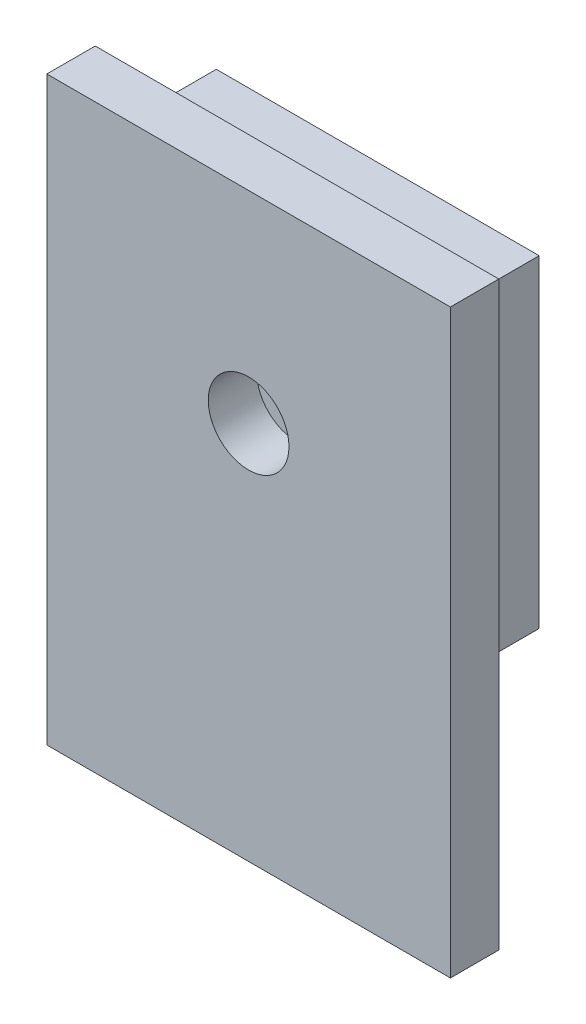
ISO-10303-21;
HEADER;
FILE_DESCRIPTION(('STEP AP214'),'2;1');
FILE_NAME('part.step','',(''),(''),'','','');
FILE_SCHEMA(('AUTOMOTIVE_DESIGN { 1 0 10303 214 1 1 1 1 }'));
ENDSEC;
DATA;
#1=APPLICATION_CONTEXT('core data for automotive mechanical design processes');
#2=APPLICATION_PROTOCOL_DEFINITION('international standard','automotive_design',2000,#1);
#3=PRODUCT_CONTEXT('',#1,'mechanical');
#4=PRODUCT('Part','Part','',(#3));
#5=PRODUCT_RELATED_PRODUCT_CATEGORY('part','',(#4));
#6=PRODUCT_DEFINITION_FORMATION('','',#4);
#7=PRODUCT_DEFINITION_CONTEXT('part definition',#1,'design');
#8=PRODUCT_DEFINITION('design','',#6,#7);
#9=PRODUCT_DEFINITION_SHAPE('','',#8);
#10=(LENGTH_UNIT() NAMED_UNIT(*) SI_UNIT(.MILLI.,.METRE.));
#11=(NAMED_UNIT(*) PLANE_ANGLE_UNIT() SI_UNIT($,.RADIAN.));
#12=(NAMED_UNIT(*) SI_UNIT($,.STERADIAN.) SOLID_ANGLE_UNIT());
#13=UNCERTAINTY_MEASURE_WITH_UNIT(LENGTH_MEASURE(1.E-05),#10,'distance_accuracy_value','');
#14=(GEOMETRIC_REPRESENTATION_CONTEXT(3) GLOBAL_UNCERTAINTY_ASSIGNED_CONTEXT((#13)) GLOBAL_UNIT_ASSIGNED_CONTEXT((#10,
#11,#12)) REPRESENTATION_CONTEXT('',''));
#15=CARTESIAN_POINT('',(0.,0.,0.));
#16=DIRECTION('',(0.,0.,1.));
#17=DIRECTION('',(1.,0.,0.));
#18=AXIS2_PLACEMENT_3D('',#15,#16,#17);
#19=CARTESIAN_POINT('',(-1.00208293355679,0.997840992775482,-1.6));
#20=DIRECTION('',(0.,0.,-1.));
#21=DIRECTION('',(-1.,0.,0.));
#22=AXIS2_PLACEMENT_3D('',#19,#20,#21);
#23=CYLINDRICAL_SURFACE('',#22,0.25);
#24=CARTESIAN_POINT('',(-1.00208293355679,0.997840992775482,-1.6));
#25=DIRECTION('',(0.,0.,-1.));
#26=DIRECTION('',(-1.,0.,0.));
#27=AXIS2_PLACEMENT_3D('',#24,#25,#26);
#28=CIRCLE('',#27,0.25);
#29=CARTESIAN_POINT('',(-1.25208293355679,0.997840992775482,-1.6));
#30=VERTEX_POINT('',#29);
#31=EDGE_CURVE('P0_E126',#30,#30,#28,.T.);
#32=ORIENTED_EDGE('',*,*,#31,.T.);
#33=EDGE_LOOP('',(#32));
#34=FACE_BOUND('',#33,.T.);
#35=CARTESIAN_POINT('',(-1.00208293355679,0.997840992775482,-1.59));
#36=DIRECTION('',(0.,0.,-1.));
#37=DIRECTION('',(-1.,0.,0.));
#38=AXIS2_PLACEMENT_3D('',#35,#36,#37);
#39=CIRCLE('',#38,0.25);
#40=CARTESIAN_POINT('',(-1.25208293355679,0.997840992775482,-1.59));
#41=VERTEX_POINT('',#40);
#42=EDGE_CURVE('P0_E11',#41,#41,#39,.T.);
#43=ORIENTED_EDGE('',*,*,#42,.F.);
#44=EDGE_LOOP('',(#43));
#45=FACE_BOUND('',#44,.T.);
#46=ADVANCED_FACE('P0_F19',(#34,#45),#23,.F.);
#47=CARTESIAN_POINT('',(-1.00208293355679,0.997840992775482,-1.59));
#48=DIRECTION('',(0.,0.,1.));
#49=DIRECTION('',(1.,0.,0.));
#50=AXIS2_PLACEMENT_3D('',#47,#48,#49);
#51=PLANE('',#50);
#52=ORIENTED_EDGE('',*,*,#42,.T.);
#53=EDGE_LOOP('',(#52));
#54=FACE_BOUND('',#53,.T.);
#55=ADVANCED_FACE('P0_F230',(#54),#51,.F.);
#56=CARTESIAN_POINT('',(-2.,-2.,-0.6));
#57=DIRECTION('',(0.,1.,0.));
#58=DIRECTION('',(1.,0.,0.));
#59=AXIS2_PLACEMENT_3D('',#56,#57,#58);
#60=PLANE('',#59);
#61=DIRECTION('',(1.,0.,0.));
#62=VECTOR('',#61,1.);
#63=CARTESIAN_POINT('',(-2.,-2.,-0.6));
#64=LINE('',#63,#62);
#65=CARTESIAN_POINT('',(-2.,-2.,-0.6));
#66=VERTEX_POINT('',#65);
#67=CARTESIAN_POINT('',(2.,-2.,-0.6));
#68=VERTEX_POINT('',#67);
#69=EDGE_CURVE('P0_E97',#66,#68,#64,.T.);
#70=ORIENTED_EDGE('',*,*,#69,.F.);
#71=DIRECTION('',(0.,0.,-1.));
#72=VECTOR('',#71,1.);
#73=CARTESIAN_POINT('',(-2.,-2.,-0.6));
#74=LINE('',#73,#72);
#75=CARTESIAN_POINT('',(-2.,-2.,-1.6));
#76=VERTEX_POINT('',#75);
#77=EDGE_CURVE('P0_E30',#66,#76,#74,.T.);
#78=ORIENTED_EDGE('',*,*,#77,.T.);
#79=DIRECTION('',(1.,0.,0.));
#80=VECTOR('',#79,1.);
#81=CARTESIAN_POINT('',(-2.,-2.,-1.6));
#82=LINE('',#81,#80);
#83=CARTESIAN_POINT('',(2.,-2.,-1.6));
#84=VERTEX_POINT('',#83);
#85=EDGE_CURVE('P0_E109',#76,#84,#82,.T.);
#86=ORIENTED_EDGE('',*,*,#85,.T.);
#87=DIRECTION('',(0.,0.,-1.));
#88=VECTOR('',#87,1.);
#89=CARTESIAN_POINT('',(2.,-2.,-0.6));
#90=LINE('',#89,#88);
#91=EDGE_CURVE('P0_E85',#68,#84,#90,.T.);
#92=ORIENTED_EDGE('',*,*,#91,.F.);
#93=EDGE_LOOP('',(#70,#78,#86,#92));
#94=FACE_BOUND('',#93,.T.);
#95=ADVANCED_FACE('P0_F220',(#94),#60,.F.);
#96=CARTESIAN_POINT('',(-2.,2.,-0.6));
#97=DIRECTION('',(1.,0.,0.));
#98=DIRECTION('',(0.,1.,0.));
#99=AXIS2_PLACEMENT_3D('',#96,#97,#98);
#100=PLANE('',#99);
#101=DIRECTION('',(0.,-1.,0.));
#102=VECTOR('',#101,1.);
#103=CARTESIAN_POINT('',(-2.,2.,-0.6));
#104=LINE('',#103,#102);
#105=CARTESIAN_POINT('',(-2.,2.,-0.6));
#106=VERTEX_POINT('',#105);
#107=EDGE_CURVE('P0_E92',#106,#66,#104,.T.);
#108=ORIENTED_EDGE('',*,*,#107,.F.);
#109=DIRECTION('',(0.,0.,-1.));
#110=VECTOR('',#109,1.);
#111=CARTESIAN_POINT('',(-2.,2.,-0.6));
#112=LINE('',#111,#110);
#113=CARTESIAN_POINT('',(-2.,2.,-1.6));
#114=VERTEX_POINT('',#113);
#115=EDGE_CURVE('P0_E70',#106,#114,#112,.T.);
#116=ORIENTED_EDGE('',*,*,#115,.T.);
#117=DIRECTION('',(0.,-1.,0.));
#118=VECTOR('',#117,1.);
#119=CARTESIAN_POINT('',(-2.,2.,-1.6));
#120=LINE('',#119,#118);
#121=EDGE_CURVE('P0_E106',#114,#76,#120,.T.);
#122=ORIENTED_EDGE('',*,*,#121,.T.);
#123=ORIENTED_EDGE('',*,*,#77,.F.);
#124=EDGE_LOOP('',(#108,#116,#122,#123));
#125=FACE_BOUND('',#124,.T.);
#126=ADVANCED_FACE('P0_F209',(#125),#100,.F.);
#127=CARTESIAN_POINT('',(2.,2.,-0.6));
#128=DIRECTION('',(0.,-1.,0.));
#129=DIRECTION('',(0.,0.,-1.));
#130=AXIS2_PLACEMENT_3D('',#127,#128,#129);
#131=PLANE('',#130);
#132=DIRECTION('',(-1.,0.,0.));
#133=VECTOR('',#132,1.);
#134=CARTESIAN_POINT('',(2.,2.,-0.6));
#135=LINE('',#134,#133);
#136=CARTESIAN_POINT('',(2.,2.,-0.6));
#137=VERTEX_POINT('',#136);
#138=EDGE_CURVE('P0_E88',#137,#106,#135,.T.);
#139=ORIENTED_EDGE('',*,*,#138,.F.);
#140=DIRECTION('',(0.,0.,-1.));
#141=VECTOR('',#140,1.);
#142=CARTESIAN_POINT('',(2.,2.,-0.6));
#143=LINE('',#142,#141);
#144=CARTESIAN_POINT('',(2.,2.,-1.6));
#145=VERTEX_POINT('',#144);
#146=EDGE_CURVE('P0_E77',#137,#145,#143,.T.);
#147=ORIENTED_EDGE('',*,*,#146,.T.);
#148=DIRECTION('',(-1.,0.,0.));
#149=VECTOR('',#148,1.);
#150=CARTESIAN_POINT('',(2.,2.,-1.6));
#151=LINE('',#150,#149);
#152=EDGE_CURVE('P0_E23',#145,#114,#151,.T.);
#153=ORIENTED_EDGE('',*,*,#152,.T.);
#154=ORIENTED_EDGE('',*,*,#115,.F.);
#155=EDGE_LOOP('',(#139,#147,#153,#154));
#156=FACE_BOUND('',#155,.T.);
#157=ADVANCED_FACE('P0_F21',(#156),#131,.F.);
#158=CARTESIAN_POINT('',(2.,-2.,-0.6));
#159=DIRECTION('',(-1.,0.,0.));
#160=DIRECTION('',(0.,0.,1.));
#161=AXIS2_PLACEMENT_3D('',#158,#159,#160);
#162=PLANE('',#161);
#163=DIRECTION('',(0.,1.,0.));
#164=VECTOR('',#163,1.);
#165=CARTESIAN_POINT('',(2.,-2.,-0.6));
#166=LINE('',#165,#164);
#167=EDGE_CURVE('P0_E80',#68,#137,#166,.T.);
#168=ORIENTED_EDGE('',*,*,#167,.F.);
#169=ORIENTED_EDGE('',*,*,#91,.T.);
#170=DIRECTION('',(0.,1.,0.));
#171=VECTOR('',#170,1.);
#172=CARTESIAN_POINT('',(2.,-2.,-1.6));
#173=LINE('',#172,#171);
#174=EDGE_CURVE('P0_E82',#84,#145,#173,.T.);
#175=ORIENTED_EDGE('',*,*,#174,.T.);
#176=ORIENTED_EDGE('',*,*,#146,.F.);
#177=EDGE_LOOP('',(#168,#169,#175,#176));
#178=FACE_BOUND('',#177,.T.);
#179=ADVANCED_FACE('P0_F78',(#178),#162,.F.);
#180=CARTESIAN_POINT('',(0.,0.,-1.6));
#181=DIRECTION('',(0.,0.,1.));
#182=DIRECTION('',(1.,0.,0.));
#183=AXIS2_PLACEMENT_3D('',#180,#181,#182);
#184=PLANE('',#183);
#185=ORIENTED_EDGE('',*,*,#174,.F.);
#186=ORIENTED_EDGE('',*,*,#85,.F.);
#187=ORIENTED_EDGE('',*,*,#121,.F.);
#188=ORIENTED_EDGE('',*,*,#152,.F.);
#189=EDGE_LOOP('',(#185,#186,#187,#188));
#190=FACE_BOUND('',#189,.T.);
#191=ORIENTED_EDGE('',*,*,#31,.F.);
#192=EDGE_LOOP('',(#191));
#193=FACE_BOUND('',#192,.T.);
#194=ADVANCED_FACE('P0_F178',(#190,#193),#184,.F.);
#195=CARTESIAN_POINT('',(0.,0.,-0.6));
#196=DIRECTION('',(0.,0.,1.));
#197=DIRECTION('',(1.,0.,0.));
#198=AXIS2_PLACEMENT_3D('',#195,#196,#197);
#199=PLANE('',#198);
#200=ORIENTED_EDGE('',*,*,#167,.T.);
#201=ORIENTED_EDGE('',*,*,#138,.T.);
#202=ORIENTED_EDGE('',*,*,#107,.T.);
#203=ORIENTED_EDGE('',*,*,#69,.T.);
#204=EDGE_LOOP('',(#200,#201,#202,#203));
#205=FACE_BOUND('',#204,.T.);
#206=ADVANCED_FACE('P0_F95',(#205),#199,.T.);
#207=CLOSED_SHELL('',(#46,#55,#95,#126,#157,#179,#194,#206));
#208=MANIFOLD_SOLID_BREP('P0_B1',#207);
#209=CARTESIAN_POINT('',(0.,0.,0.));
#210=DIRECTION('',(0.,0.,1.));
#211=DIRECTION('',(1.,0.,0.));
#212=AXIS2_PLACEMENT_3D('',#209,#210,#211);
#213=CYLINDRICAL_SURFACE('',#212,0.5);
#214=CARTESIAN_POINT('',(0.,0.,-0.6));
#215=DIRECTION('',(0.,0.,-1.));
#216=DIRECTION('',(1.,0.,0.));
#217=AXIS2_PLACEMENT_3D('',#214,#215,#216);
#218=CIRCLE('',#217,0.5);
#219=CARTESIAN_POINT('',(0.5,0.,-0.6));
#220=VERTEX_POINT('',#219);
#221=EDGE_CURVE('P1_E84',#220,#220,#218,.T.);
#222=ORIENTED_EDGE('',*,*,#221,.T.);
#223=EDGE_LOOP('',(#222));
#224=FACE_BOUND('',#223,.T.);
#225=CARTESIAN_POINT('',(0.,0.,0.));
#226=DIRECTION('',(0.,0.,-1.));
#227=DIRECTION('',(1.,0.,0.));
#228=AXIS2_PLACEMENT_3D('',#225,#226,#227);
#229=CIRCLE('',#228,0.5);
#230=CARTESIAN_POINT('',(0.5,0.,0.));
#231=VERTEX_POINT('',#230);
#232=EDGE_CURVE('P1_E23',#231,#231,#229,.T.);
#233=ORIENTED_EDGE('',*,*,#232,.F.);
#234=EDGE_LOOP('',(#233));
#235=FACE_BOUND('',#234,.T.);
#236=ADVANCED_FACE('P1_F19',(#224,#235),#213,.F.);
#237=CARTESIAN_POINT('',(-2.5,-4.7,0.));
#238=DIRECTION('',(0.,1.,0.));
#239=DIRECTION('',(1.,0.,0.));
#240=AXIS2_PLACEMENT_3D('',#237,#238,#239);
#241=PLANE('',#240);
#242=DIRECTION('',(-1.,0.,0.));
#243=VECTOR('',#242,1.);
#244=CARTESIAN_POINT('',(2.5,-4.7,0.));
#245=LINE('',#244,#243);
#246=CARTESIAN_POINT('',(2.5,-4.7,0.));
#247=VERTEX_POINT('',#246);
#248=CARTESIAN_POINT('',(-2.5,-4.7,0.));
#249=VERTEX_POINT('',#248);
#250=EDGE_CURVE('P1_E89',#247,#249,#245,.T.);
#251=ORIENTED_EDGE('',*,*,#250,.T.);
#252=DIRECTION('',(0.,0.,-1.));
#253=VECTOR('',#252,1.);
#254=CARTESIAN_POINT('',(-2.5,-4.7,0.));
#255=LINE('',#254,#253);
#256=CARTESIAN_POINT('',(-2.5,-4.7,-0.6));
#257=VERTEX_POINT('',#256);
#258=EDGE_CURVE('P1_E11',#249,#257,#255,.T.);
#259=ORIENTED_EDGE('',*,*,#258,.T.);
#260=DIRECTION('',(1.,0.,0.));
#261=VECTOR('',#260,1.);
#262=CARTESIAN_POINT('',(2.5,-4.7,-0.6));
#263=LINE('',#262,#261);
#264=CARTESIAN_POINT('',(2.5,-4.7,-0.6));
#265=VERTEX_POINT('',#264);
#266=EDGE_CURVE('P1_E96',#257,#265,#263,.T.);
#267=ORIENTED_EDGE('',*,*,#266,.T.);
#268=DIRECTION('',(0.,0.,-1.));
#269=VECTOR('',#268,1.);
#270=CARTESIAN_POINT('',(2.5,-4.7,0.));
#271=LINE('',#270,#269);
#272=EDGE_CURVE('P1_E77',#247,#265,#271,.T.);
#273=ORIENTED_EDGE('',*,*,#272,.F.);
#274=EDGE_LOOP('',(#251,#259,#267,#273));
#275=FACE_BOUND('',#274,.T.);
#276=ADVANCED_FACE('P1_F215',(#275),#241,.F.);
#277=CARTESIAN_POINT('',(-2.5,2.5,0.));
#278=DIRECTION('',(1.,0.,0.));
#279=DIRECTION('',(0.,1.,0.));
#280=AXIS2_PLACEMENT_3D('',#277,#278,#279);
#281=PLANE('',#280);
#282=DIRECTION('',(0.,1.,0.));
#283=VECTOR('',#282,1.);
#284=CARTESIAN_POINT('',(-2.5,0.,0.));
#285=LINE('',#284,#283);
#286=CARTESIAN_POINT('',(-2.5,2.5,0.));
#287=VERTEX_POINT('',#286);
#288=EDGE_CURVE('P1_E99',#249,#287,#285,.T.);
#289=ORIENTED_EDGE('',*,*,#288,.T.);
#290=DIRECTION('',(0.,0.,-1.));
#291=VECTOR('',#290,1.);
#292=CARTESIAN_POINT('',(-2.5,2.5,0.));
#293=LINE('',#292,#291);
#294=CARTESIAN_POINT('',(-2.5,2.5,-0.6));
#295=VERTEX_POINT('',#294);
#296=EDGE_CURVE('P1_E30',#287,#295,#293,.T.);
#297=ORIENTED_EDGE('',*,*,#296,.T.);
#298=DIRECTION('',(0.,-1.,0.));
#299=VECTOR('',#298,1.);
#300=CARTESIAN_POINT('',(-2.5,0.,-0.6));
#301=LINE('',#300,#299);
#302=EDGE_CURVE('P1_E107',#295,#257,#301,.T.);
#303=ORIENTED_EDGE('',*,*,#302,.T.);
#304=ORIENTED_EDGE('',*,*,#258,.F.);
#305=EDGE_LOOP('',(#289,#297,#303,#304));
#306=FACE_BOUND('',#305,.T.);
#307=ADVANCED_FACE('P1_F206',(#306),#281,.F.);
#308=CARTESIAN_POINT('',(2.5,2.5,0.));
#309=DIRECTION('',(0.,-1.,0.));
#310=DIRECTION('',(0.,0.,-1.));
#311=AXIS2_PLACEMENT_3D('',#308,#309,#310);
#312=PLANE('',#311);
#313=DIRECTION('',(1.,0.,0.));
#314=VECTOR('',#313,1.);
#315=CARTESIAN_POINT('',(-2.5,2.5,0.));
#316=LINE('',#315,#314);
#317=CARTESIAN_POINT('',(2.5,2.5,0.));
#318=VERTEX_POINT('',#317);
#319=EDGE_CURVE('P1_E115',#287,#318,#316,.T.);
#320=ORIENTED_EDGE('',*,*,#319,.T.);
#321=DIRECTION('',(0.,0.,-1.));
#322=VECTOR('',#321,1.);
#323=CARTESIAN_POINT('',(2.5,2.5,0.));
#324=LINE('',#323,#322);
#325=CARTESIAN_POINT('',(2.5,2.5,-0.6));
#326=VERTEX_POINT('',#325);
#327=EDGE_CURVE('P1_E108',#318,#326,#324,.T.);
#328=ORIENTED_EDGE('',*,*,#327,.T.);
#329=DIRECTION('',(-1.,0.,0.));
#330=VECTOR('',#329,1.);
#331=CARTESIAN_POINT('',(-2.5,2.5,-0.6));
#332=LINE('',#331,#330);
#333=EDGE_CURVE('P1_E104',#326,#295,#332,.T.);
#334=ORIENTED_EDGE('',*,*,#333,.T.);
#335=ORIENTED_EDGE('',*,*,#296,.F.);
#336=EDGE_LOOP('',(#320,#328,#334,#335));
#337=FACE_BOUND('',#336,.T.);
#338=ADVANCED_FACE('P1_F21',(#337),#312,.F.);
#339=CARTESIAN_POINT('',(2.5,-4.7,0.));
#340=DIRECTION('',(-1.,0.,0.));
#341=DIRECTION('',(0.,0.,1.));
#342=AXIS2_PLACEMENT_3D('',#339,#340,#341);
#343=PLANE('',#342);
#344=DIRECTION('',(0.,-1.,0.));
#345=VECTOR('',#344,1.);
#346=CARTESIAN_POINT('',(2.5,0.,0.));
#347=LINE('',#346,#345);
#348=EDGE_CURVE('P1_E118',#318,#247,#347,.T.);
#349=ORIENTED_EDGE('',*,*,#348,.T.);
#350=ORIENTED_EDGE('',*,*,#272,.T.);
#351=DIRECTION('',(0.,1.,0.));
#352=VECTOR('',#351,1.);
#353=CARTESIAN_POINT('',(2.5,0.,-0.6));
#354=LINE('',#353,#352);
#355=EDGE_CURVE('P1_E88',#265,#326,#354,.T.);
#356=ORIENTED_EDGE('',*,*,#355,.T.);
#357=ORIENTED_EDGE('',*,*,#327,.F.);
#358=EDGE_LOOP('',(#349,#350,#356,#357));
#359=FACE_BOUND('',#358,.T.);
#360=ADVANCED_FACE('P1_F187',(#359),#343,.F.);
#361=CARTESIAN_POINT('',(0.,-1.1,-0.6));
#362=DIRECTION('',(0.,0.,1.));
#363=DIRECTION('',(1.,0.,0.));
#364=AXIS2_PLACEMENT_3D('',#361,#362,#363);
#365=PLANE('',#364);
#366=ORIENTED_EDGE('',*,*,#355,.F.);
#367=ORIENTED_EDGE('',*,*,#266,.F.);
#368=ORIENTED_EDGE('',*,*,#302,.F.);
#369=ORIENTED_EDGE('',*,*,#333,.F.);
#370=EDGE_LOOP('',(#366,#367,#368,#369));
#371=FACE_BOUND('',#370,.T.);
#372=ORIENTED_EDGE('',*,*,#221,.F.);
#373=EDGE_LOOP('',(#372));
#374=FACE_BOUND('',#373,.T.);
#375=ADVANCED_FACE('P1_F173',(#371,#374),#365,.F.);
#376=CARTESIAN_POINT('',(0.,-1.1,0.));
#377=DIRECTION('',(0.,0.,1.));
#378=DIRECTION('',(1.,0.,0.));
#379=AXIS2_PLACEMENT_3D('',#376,#377,#378);
#380=PLANE('',#379);
#381=ORIENTED_EDGE('',*,*,#348,.F.);
#382=ORIENTED_EDGE('',*,*,#319,.F.);
#383=ORIENTED_EDGE('',*,*,#288,.F.);
#384=ORIENTED_EDGE('',*,*,#250,.F.);
#385=EDGE_LOOP('',(#381,#382,#383,#384));
#386=FACE_BOUND('',#385,.T.);
#387=ORIENTED_EDGE('',*,*,#232,.T.);
#388=EDGE_LOOP('',(#387));
#389=FACE_BOUND('',#388,.T.);
#390=ADVANCED_FACE('P1_F164',(#386,#389),#380,.T.);
#391=CLOSED_SHELL('',(#236,#276,#307,#338,#360,#375,#390));
#392=MANIFOLD_SOLID_BREP('P1_B1',#391);
#393=ADVANCED_BREP_SHAPE_REPRESENTATION('',(#18,#208,#392),#14);
#394=SHAPE_DEFINITION_REPRESENTATION(#9,#393);
ENDSEC;
END-ISO-10303-21;
